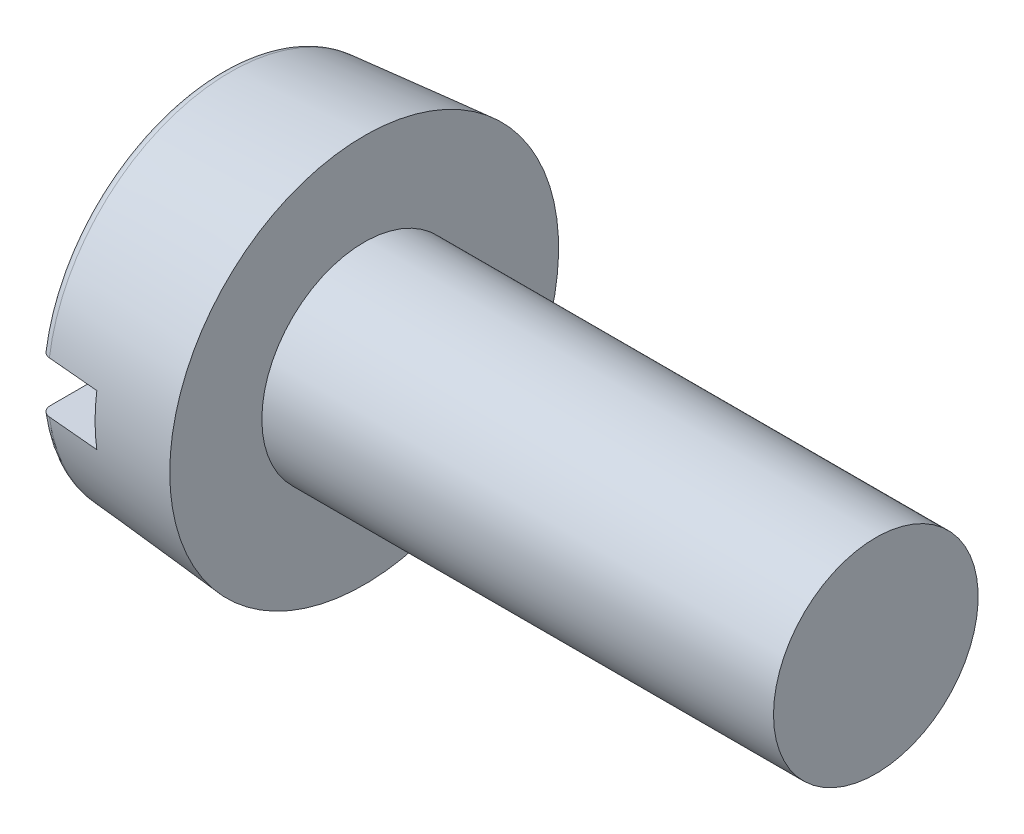
ISO-10303-21;
HEADER;
FILE_DESCRIPTION(('STEP AP214'),'2;1');
FILE_NAME('part.step','',(''),(''),'','','');
FILE_SCHEMA(('AUTOMOTIVE_DESIGN { 1 0 10303 214 1 1 1 1 }'));
ENDSEC;
DATA;
#1=APPLICATION_CONTEXT('core data for automotive mechanical design processes');
#2=APPLICATION_PROTOCOL_DEFINITION('international standard','automotive_design',2000,#1);
#3=PRODUCT_CONTEXT('',#1,'mechanical');
#4=PRODUCT('Part','Part','',(#3));
#5=PRODUCT_RELATED_PRODUCT_CATEGORY('part','',(#4));
#6=PRODUCT_DEFINITION_FORMATION('','',#4);
#7=PRODUCT_DEFINITION_CONTEXT('part definition',#1,'design');
#8=PRODUCT_DEFINITION('design','',#6,#7);
#9=PRODUCT_DEFINITION_SHAPE('','',#8);
#10=(LENGTH_UNIT() NAMED_UNIT(*) SI_UNIT(.MILLI.,.METRE.));
#11=(NAMED_UNIT(*) PLANE_ANGLE_UNIT() SI_UNIT($,.RADIAN.));
#12=(NAMED_UNIT(*) SI_UNIT($,.STERADIAN.) SOLID_ANGLE_UNIT());
#13=UNCERTAINTY_MEASURE_WITH_UNIT(LENGTH_MEASURE(1.E-05),#10,'distance_accuracy_value','');
#14=(GEOMETRIC_REPRESENTATION_CONTEXT(3) GLOBAL_UNCERTAINTY_ASSIGNED_CONTEXT((#13)) GLOBAL_UNIT_ASSIGNED_CONTEXT((#10,
#11,#12)) REPRESENTATION_CONTEXT('',''));
#15=CARTESIAN_POINT('',(0.,0.,0.));
#16=DIRECTION('',(0.,0.,1.));
#17=DIRECTION('',(1.,0.,0.));
#18=AXIS2_PLACEMENT_3D('',#15,#16,#17);
#19=CARTESIAN_POINT('',(0.,0.,0.));
#20=DIRECTION('',(-1.,0.,0.));
#21=DIRECTION('',(0.,0.,1.));
#22=AXIS2_PLACEMENT_3D('',#19,#20,#21);
#23=PLANE('',#22);
#24=DIRECTION('',(0.,0.,-1.));
#25=VECTOR('',#24,1.);
#26=CARTESIAN_POINT('',(0.,0.25,1.9));
#27=LINE('',#26,#25);
#28=CARTESIAN_POINT('',(0.,0.25,1.66724343126456));
#29=VERTEX_POINT('',#28);
#30=CARTESIAN_POINT('',(0.,0.25,-1.66724343126456));
#31=VERTEX_POINT('',#30);
#32=EDGE_CURVE('E84',#29,#31,#27,.T.);
#33=ORIENTED_EDGE('',*,*,#32,.F.);
#34=CARTESIAN_POINT('',(0.,0.,0.));
#35=DIRECTION('',(-1.,0.,0.));
#36=DIRECTION('',(0.,0.,1.));
#37=AXIS2_PLACEMENT_3D('',#34,#35,#36);
#38=CIRCLE('',#37,1.68588275366196);
#39=EDGE_CURVE('E86',#29,#31,#38,.T.);
#40=ORIENTED_EDGE('',*,*,#39,.T.);
#41=EDGE_LOOP('',(#33,#40));
#42=FACE_BOUND('',#41,.T.);
#43=ADVANCED_FACE('F16',(#42),#23,.T.);
#44=CARTESIAN_POINT('',(0.1,0.,0.));
#45=DIRECTION('',(-1.,0.,0.));
#46=DIRECTION('',(0.,0.,1.));
#47=AXIS2_PLACEMENT_3D('',#44,#45,#46);
#48=TOROIDAL_SURFACE('',#47,1.68588275366196,0.1);
#49=CARTESIAN_POINT('',(0.0301239837184526,0.25,-1.73954570987134));
#50=CARTESIAN_POINT('',(0.0341122540256549,0.25,-1.74348114703535));
#51=CARTESIAN_POINT('',(0.0384332916495908,0.25,-1.74708479745269));
#52=CARTESIAN_POINT('',(0.047621596888568,0.25,-1.75351988324919));
#53=CARTESIAN_POINT('',(0.0524894518418905,0.25,-1.75635047687334));
#54=CARTESIAN_POINT('',(0.0626321269057779,0.25,-1.7611518726827));
#55=CARTESIAN_POINT('',(0.0679068945512783,0.25,-1.76312278549306));
#56=CARTESIAN_POINT('',(0.07871224547132,0.25,-1.76614517825523));
#57=CARTESIAN_POINT('',(0.0842427666888276,0.25,-1.76719688002821));
#58=CARTESIAN_POINT('',(0.0953733944439471,0.25,-1.76834695503076));
#59=CARTESIAN_POINT('',(0.100972999637236,0.25,-1.76845018239128));
#60=CARTESIAN_POINT('',(0.112109811915657,0.25,-1.76771285537891));
#61=CARTESIAN_POINT('',(0.117647018058241,0.25,-1.76687228676909));
#62=CARTESIAN_POINT('',(0.128489803717952,0.25,-1.76427538353904));
#63=CARTESIAN_POINT('',(0.133795848010853,0.25,-1.76252098799906));
#64=CARTESIAN_POINT('',(0.14403973031954,0.25,-1.75814968615088));
#65=CARTESIAN_POINT('',(0.148977564711526,0.25,-1.75553277135542));
#66=CARTESIAN_POINT('',(0.15836674169469,0.25,-1.74950124280131));
#67=CARTESIAN_POINT('',(0.162816088565465,0.25,-1.74608352334629));
#68=CARTESIAN_POINT('',(0.171083921068068,0.25,-1.73855542384798));
#69=CARTESIAN_POINT('',(0.174902382724926,0.25,-1.73444501749311));
#70=CARTESIAN_POINT('',(0.181835504151915,0.25,-1.72561114445745));
#71=CARTESIAN_POINT('',(0.184943867145123,0.25,-1.72088273649891));
#72=CARTESIAN_POINT('',(0.190331805109599,0.25,-1.71097526726483));
#73=CARTESIAN_POINT('',(0.19261133485436,0.25,-1.7057961814165));
#74=CARTESIAN_POINT('',(0.19630050346213,0.25,-1.69507883946751));
#75=CARTESIAN_POINT('',(0.197701208750648,0.25,-1.68953750769915));
#76=CARTESIAN_POINT('',(0.199560107931746,0.25,-1.67829891478366));
#77=CARTESIAN_POINT('',(0.200018256978501,0.25,-1.67260164623029));
#78=CARTESIAN_POINT('',(0.199980488082452,0.25,-1.66116755240173));
#79=CARTESIAN_POINT('',(0.199477416691625,0.25,-1.65543074959807));
#80=CARTESIAN_POINT('',(0.197516883099685,0.25,-1.64412247089109));
#81=CARTESIAN_POINT('',(0.19605940106392,0.25,-1.6385509984262));
#82=CARTESIAN_POINT('',(0.192226434881595,0.25,-1.62772407078967));
#83=CARTESIAN_POINT('',(0.189849634285873,0.25,-1.62246908134511));
#84=CARTESIAN_POINT('',(0.184242507962168,0.25,-1.61243590232117));
#85=CARTESIAN_POINT('',(0.181012200803495,0.25,-1.60765770237164));
#86=CARTESIAN_POINT('',(0.173808398364609,0.25,-1.59874552852762));
#87=CARTESIAN_POINT('',(0.169839413654341,0.25,-1.59460791001411));
#88=CARTESIAN_POINT('',(0.161256212040593,0.25,-1.58706689346002));
#89=CARTESIAN_POINT('',(0.156642033668647,0.25,-1.58366345160462));
#90=CARTESIAN_POINT('',(0.146954193747203,0.25,-1.57772830420901));
#91=CARTESIAN_POINT('',(0.141886222152689,0.25,-1.57518731173971));
#92=CARTESIAN_POINT('',(0.131392256265676,0.25,-1.57100326499133));
#93=CARTESIAN_POINT('',(0.125966286684049,0.25,-1.5693601488087));
#94=CARTESIAN_POINT('',(0.114975418023079,0.25,-1.56703614777695));
#95=CARTESIAN_POINT('',(0.109412743361664,0.25,-1.56634473553344));
#96=CARTESIAN_POINT('',(0.0982506296477884,0.25,-1.56591134324024));
#97=CARTESIAN_POINT('',(0.0926511921124149,0.25,-1.56616932425487));
#98=CARTESIAN_POINT('',(0.0816068018037832,0.25,-1.56762261837648));
#99=CARTESIAN_POINT('',(0.0761611699810638,0.25,-1.56881278083002));
#100=CARTESIAN_POINT('',(0.0655461187744446,0.25,-1.57208782392461));
#101=CARTESIAN_POINT('',(0.0603767005480555,0.25,-1.5741727083148));
#102=CARTESIAN_POINT('',(0.0504429211594085,0.25,-1.57918218125947));
#103=CARTESIAN_POINT('',(0.045679818847785,0.25,-1.58210926476463));
#104=CARTESIAN_POINT('',(0.0367063855830669,0.25,-1.58871421123321));
#105=CARTESIAN_POINT('',(0.0324960808997952,0.25,-1.59239210985535));
#106=CARTESIAN_POINT('',(0.0247028499071558,0.25,-1.60043217731811));
#107=CARTESIAN_POINT('',(0.0211264966781289,0.25,-1.60480071638002));
#108=CARTESIAN_POINT('',(0.0147478039662313,0.25,-1.61407035663433));
#109=CARTESIAN_POINT('',(0.0119455146325413,0.25,-1.61897149230335));
#110=CARTESIAN_POINT('',(0.00716047536747469,0.25,-1.62922901712882));
#111=CARTESIAN_POINT('',(0.0051877301006121,0.25,-1.6345900743117));
#112=CARTESIAN_POINT('',(0.00216211004761551,0.25,-1.64556559292559));
#113=CARTESIAN_POINT('',(0.00110924708522813,0.25,-1.6511800576128));
#114=CARTESIAN_POINT('',(-5.33425649796273E-05,0.25,-1.66255157007252));
#115=CARTESIAN_POINT('',(-0.000155417619311508,0.25,-1.6683094013264));
#116=CARTESIAN_POINT('',(0.000607195995681125,0.25,-1.67976235656453));
#117=CARTESIAN_POINT('',(0.00147213868127254,0.25,-1.68545746367547));
#118=CARTESIAN_POINT('',(0.0041486989547703,0.25,-1.69663068032758));
#119=CARTESIAN_POINT('',(0.00596193608673292,0.25,-1.70210840133309));
#120=CARTESIAN_POINT('',(0.0104866705202575,0.25,-1.71267417663621));
#121=CARTESIAN_POINT('',(0.0131970742616456,0.25,-1.71776269608293));
#122=CARTESIAN_POINT('',(0.0183021368753954,0.25,-1.72564874312836));
#123=CARTESIAN_POINT('',(0.020453426675583,0.25,-1.72860667972899));
#124=CARTESIAN_POINT('',(0.0250639712199919,0.25,-1.73427200964239));
#125=CARTESIAN_POINT('',(0.0275232249959102,0.25,-1.73697940374288));
#126=CARTESIAN_POINT('',(0.0301239837184526,0.25,-1.73954570987134));
#127=B_SPLINE_CURVE_WITH_KNOTS('',3,(#49,#50,#51,#52,#53,#54,#55,#56,#57,#58,#59,#60,#61,#62,
#63,#64,#65,#66,#67,#68,#69,#70,#71,#72,#73,#74,#75,#76,#77,#78,#79,#80,#81,#82,#83,#84,#85,#86,
#87,#88,#89,#90,#91,#92,#93,#94,#95,#96,#97,#98,#99,#100,#101,#102,#103,#104,#105,#106,#107,
#108,#109,#110,#111,#112,#113,#114,#115,#116,#117,#118,#119,#120,#121,#122,#123,#124,#125,#126),
.UNSPECIFIED.,.T.,.F.,(4,2,2,2,2,2,2,2,2,2,2,2,2,2,2,2,2,2,2,2,2,2,2,2,2,2,2,2,2,2,2,2,2,2,2,2,
2,2,4),(0.,0.0167959110445539,0.0336100383184074,0.0504220012837815,0.0672299061172478,
0.0839517427346652,0.100673831600296,0.117360580985523,0.134047494574589,0.150800227323111,
0.167553596564519,0.184450209981752,0.201347745249248,0.21841437976708,0.235481826278522,
0.252676784421207,0.269872099922448,0.28709213054496,0.304311786550837,0.321429553193154,
0.338546297983665,0.355472401973106,0.372397338855155,0.389133511649819,0.405868998082987,
0.422512661437949,0.439156394534983,0.455849950224764,0.472544298931967,0.489402732254279,
0.506262257525771,0.523319657239101,0.540377276197225,0.557572051898687,0.574771345386102,
0.592000109063807,0.609207949388036,0.620160629655459,0.631113275486231),.UNSPECIFIED.);
#128=CARTESIAN_POINT('',(0.0912844257252333,0.25,-1.76791351316188));
#129=VERTEX_POINT('',#128);
#130=EDGE_CURVE('E40',#31,#129,#127,.T.);
#131=ORIENTED_EDGE('',*,*,#130,.F.);
#132=ORIENTED_EDGE('',*,*,#39,.F.);
#133=CARTESIAN_POINT('',(0.038410820052543,0.25,1.58753563015566));
#134=CARTESIAN_POINT('',(0.0427902939890945,0.25,1.58407005650774));
#135=CARTESIAN_POINT('',(0.0474630469549891,0.25,1.58096901798646));
#136=CARTESIAN_POINT('',(0.0572657439915531,0.25,1.57559125576911));
#137=CARTESIAN_POINT('',(0.0623961680717354,0.25,1.57331541051488));
#138=CARTESIAN_POINT('',(0.0729671844638347,0.25,1.56966008382672));
#139=CARTESIAN_POINT('',(0.0784077499033303,0.25,1.56828052486143));
#140=CARTESIAN_POINT('',(0.0894424523036429,0.25,1.56646066317196));
#141=CARTESIAN_POINT('',(0.0950365520436793,0.25,1.56602013480384));
#142=CARTESIAN_POINT('',(0.106187916851424,0.25,1.56609100566934));
#143=CARTESIAN_POINT('',(0.111745215600338,0.25,1.56659719462549));
#144=CARTESIAN_POINT('',(0.122695887603688,0.25,1.56853573821628));
#145=CARTESIAN_POINT('',(0.128089257112214,0.25,1.56996811399837));
#146=CARTESIAN_POINT('',(0.138558934280523,0.25,1.57371510963342));
#147=CARTESIAN_POINT('',(0.143635299693182,0.25,1.57602956823661));
#148=CARTESIAN_POINT('',(0.153331512379457,0.25,1.58147155156435));
#149=CARTESIAN_POINT('',(0.15795134553212,0.25,1.58459910142768));
#150=CARTESIAN_POINT('',(0.166642844689646,0.25,1.59160307133552));
#151=CARTESIAN_POINT('',(0.170709973240089,0.25,1.59548512047214));
#152=CARTESIAN_POINT('',(0.17814400538551,0.25,1.60386991016736));
#153=CARTESIAN_POINT('',(0.181510868111661,0.25,1.6083726869273));
#154=CARTESIAN_POINT('',(0.18749050008726,0.25,1.61792751523024));
#155=CARTESIAN_POINT('',(0.190093987175764,0.25,1.62298537603827));
#156=CARTESIAN_POINT('',(0.194424575068899,0.25,1.63346332336008));
#157=CARTESIAN_POINT('',(0.196151623655145,0.25,1.63888343143487));
#158=CARTESIAN_POINT('',(0.19869656706418,0.25,1.64999030292114));
#159=CARTESIAN_POINT('',(0.19950519348372,0.25,1.65567919157282));
#160=CARTESIAN_POINT('',(0.200160111365204,0.25,1.66711218979157));
#161=CARTESIAN_POINT('',(0.200006372625092,0.25,1.67285630108605));
#162=CARTESIAN_POINT('',(0.198737358913371,0.25,1.68426056047317));
#163=CARTESIAN_POINT('',(0.197618277112315,0.25,1.68992028578478));
#164=CARTESIAN_POINT('',(0.194442698747917,0.25,1.70097049473464));
#165=CARTESIAN_POINT('',(0.192386209487117,0.25,1.70636098046993));
#166=CARTESIAN_POINT('',(0.187399427297265,0.25,1.7166994325418));
#167=CARTESIAN_POINT('',(0.18447206309478,0.25,1.72164881093218));
#168=CARTESIAN_POINT('',(0.177821112560516,0.25,1.73098021623841));
#169=CARTESIAN_POINT('',(0.174097559800524,0.25,1.73536226706347));
#170=CARTESIAN_POINT('',(0.165993769608675,0.25,1.74339353418512));
#171=CARTESIAN_POINT('',(0.161619482864613,0.25,1.74704875411543));
#172=CARTESIAN_POINT('',(0.152314080979336,0.25,1.75356401214195));
#173=CARTESIAN_POINT('',(0.147382997277304,0.25,1.75642409510351));
#174=CARTESIAN_POINT('',(0.137157313470634,0.25,1.76123793804064));
#175=CARTESIAN_POINT('',(0.131866864335231,0.25,1.76320051691167));
#176=CARTESIAN_POINT('',(0.121030177928266,0.25,1.7662021188539));
#177=CARTESIAN_POINT('',(0.115483952770112,0.25,1.76724118561497));
#178=CARTESIAN_POINT('',(0.10433726421861,0.25,1.76836005573213));
#179=CARTESIAN_POINT('',(0.0987375081693256,0.25,1.76844691644335));
#180=CARTESIAN_POINT('',(0.0876033192585389,0.25,1.76767711814466));
#181=CARTESIAN_POINT('',(0.0820688850795546,0.25,1.76682047819726));
#182=CARTESIAN_POINT('',(0.0712339359121825,0.25,1.76419215705386));
#183=CARTESIAN_POINT('',(0.065932964474412,0.25,1.76242235604695));
#184=CARTESIAN_POINT('',(0.055701702864444,0.25,1.75802135089928));
#185=CARTESIAN_POINT('',(0.0507714167878425,0.25,1.75539013724273));
#186=CARTESIAN_POINT('',(0.0413993898846341,0.25,1.74933132383135));
#187=CARTESIAN_POINT('',(0.0369596773547095,0.25,1.74590058763537));
#188=CARTESIAN_POINT('',(0.0287131089970529,0.25,1.73834824703872));
#189=CARTESIAN_POINT('',(0.024906279451321,0.25,1.73422661396116));
#190=CARTESIAN_POINT('',(0.0179981143560022,0.25,1.72537218244404));
#191=CARTESIAN_POINT('',(0.0149031090922599,0.25,1.72063444579746));
#192=CARTESIAN_POINT('',(0.00954325096840195,0.25,1.71071066098417));
#193=CARTESIAN_POINT('',(0.00727844426054889,0.25,1.70552458791341));
#194=CARTESIAN_POINT('',(0.00361981721141334,0.25,1.69479566620519));
#195=CARTESIAN_POINT('',(0.00223495300327865,0.25,1.68924976295691));
#196=CARTESIAN_POINT('',(0.000408375366709955,0.25,1.67800493025775));
#197=CARTESIAN_POINT('',(-3.3329131902211E-05,0.25,1.67230599935852));
#198=CARTESIAN_POINT('',(3.75123327413306E-05,0.25,1.66087218591111));
#199=CARTESIAN_POINT('',(0.000557074784948396,0.25,1.65513734594056));
#200=CARTESIAN_POINT('',(0.00255033342308906,0.25,1.64383422369473));
#201=CARTESIAN_POINT('',(0.00402428246581615,0.25,1.63826598596849));
#202=CARTESIAN_POINT('',(0.00788999970877085,0.25,1.62744650084935));
#203=CARTESIAN_POINT('',(0.0102834602468341,0.25,1.62219585873013));
#204=CARTESIAN_POINT('',(0.015921704624391,0.25,1.61217899485774));
#205=CARTESIAN_POINT('',(0.019165452268332,0.25,1.607412193218));
#206=CARTESIAN_POINT('',(0.0251008031700795,0.25,1.60011257766084));
#207=CARTESIAN_POINT('',(0.0275686339076156,0.25,1.59739475707804));
#208=CARTESIAN_POINT('',(0.032785764913995,0.25,1.59224410808593));
#209=CARTESIAN_POINT('',(0.0355350642370452,0.25,1.58981127871903));
#210=CARTESIAN_POINT('',(0.038410820052543,0.25,1.58753563015566));
#211=B_SPLINE_CURVE_WITH_KNOTS('',3,(#133,#134,#135,#136,#137,#138,#139,#140,#141,#142,#143,
#144,#145,#146,#147,#148,#149,#150,#151,#152,#153,#154,#155,#156,#157,#158,#159,#160,#161,#162,
#163,#164,#165,#166,#167,#168,#169,#170,#171,#172,#173,#174,#175,#176,#177,#178,#179,#180,#181,
#182,#183,#184,#185,#186,#187,#188,#189,#190,#191,#192,#193,#194,#195,#196,#197,#198,#199,#200,
#201,#202,#203,#204,#205,#206,#207,#208,#209,#210),.UNSPECIFIED.,.T.,.F.,(4,2,2,2,2,2,2,2,2,2,2,
2,2,2,2,2,2,2,2,2,2,2,2,2,2,2,2,2,2,2,2,2,2,2,2,2,2,2,4),(0.,0.0167411910060388,
0.0335001515260854,0.0502576621545573,0.0670111455902049,0.0836726971117868,0.100334629076978,
0.116993516605717,0.133652919247716,0.150441746179843,0.167231552664631,0.18421776717599,
0.201204993610686,0.218362167205904,0.235519879250061,0.252745563649484,0.269971113860592,
0.287139377595869,0.304306917563327,0.321326154497721,0.338344430931905,0.355191689226128,
0.37203815046139,0.388759667571552,0.405480846845857,0.422167733967673,0.438854805431025,
0.455608474446361,0.472362839024727,0.489260888718256,0.506159877662992,0.523228221442543,
0.540296726824198,0.557490310608038,0.574688451553918,0.591918398070691,0.609127444285945,
0.620120485883897,0.631113490544153),.UNSPECIFIED.);
#212=CARTESIAN_POINT('',(0.0912844257209469,0.25,1.76791351317857));
#213=VERTEX_POINT('',#212);
#214=EDGE_CURVE('E76',#213,#29,#211,.T.);
#215=ORIENTED_EDGE('',*,*,#214,.F.);
#216=CARTESIAN_POINT('',(0.0912844257252333,0.,0.));
#217=DIRECTION('',(-1.,0.,0.));
#218=DIRECTION('',(0.,0.,1.));
#219=AXIS2_PLACEMENT_3D('',#216,#217,#218);
#220=CIRCLE('',#219,1.78550222347114);
#221=EDGE_CURVE('E90',#129,#213,#220,.F.);
#222=ORIENTED_EDGE('',*,*,#221,.F.);
#223=EDGE_LOOP('',(#131,#132,#215,#222));
#224=FACE_BOUND('',#223,.T.);
#225=ADVANCED_FACE('F167',(#224),#48,.T.);
#226=CARTESIAN_POINT('',(-25.4,0.,0.));
#227=DIRECTION('',(-1.,0.,0.));
#228=DIRECTION('',(0.,0.,1.));
#229=AXIS2_PLACEMENT_3D('',#226,#227,#228);
#230=CYLINDRICAL_SURFACE('',#229,1.);
#231=CARTESIAN_POINT('',(6.4,0.,0.));
#232=DIRECTION('',(-1.,0.,0.));
#233=DIRECTION('',(0.,0.,1.));
#234=AXIS2_PLACEMENT_3D('',#231,#232,#233);
#235=CIRCLE('',#234,1.);
#236=CARTESIAN_POINT('',(6.4,0.,1.));
#237=VERTEX_POINT('',#236);
#238=EDGE_CURVE('E87',#237,#237,#235,.T.);
#239=ORIENTED_EDGE('',*,*,#238,.T.);
#240=EDGE_LOOP('',(#239));
#241=FACE_BOUND('',#240,.T.);
#242=CARTESIAN_POINT('',(1.4,0.,0.));
#243=DIRECTION('',(-1.,0.,0.));
#244=DIRECTION('',(0.,0.,1.));
#245=AXIS2_PLACEMENT_3D('',#242,#243,#244);
#246=CIRCLE('',#245,1.);
#247=CARTESIAN_POINT('',(1.4,0.,1.));
#248=VERTEX_POINT('',#247);
#249=EDGE_CURVE('E154',#248,#248,#246,.T.);
#250=ORIENTED_EDGE('',*,*,#249,.F.);
#251=EDGE_LOOP('',(#250));
#252=FACE_BOUND('',#251,.T.);
#253=ADVANCED_FACE('F164',(#241,#252),#230,.T.);
#254=CARTESIAN_POINT('',(6.4,1.,0.));
#255=DIRECTION('',(1.,0.,0.));
#256=DIRECTION('',(0.,0.,-1.));
#257=AXIS2_PLACEMENT_3D('',#254,#255,#256);
#258=PLANE('',#257);
#259=ORIENTED_EDGE('',*,*,#238,.F.);
#260=EDGE_LOOP('',(#259));
#261=FACE_BOUND('',#260,.T.);
#262=ADVANCED_FACE('F166',(#261),#258,.T.);
#263=DIRECTION('',(0.,0.,1.));
#264=VECTOR('',#263,1.);
#265=CARTESIAN_POINT('',(0.,-0.25,-1.9));
#266=LINE('',#265,#264);
#267=CARTESIAN_POINT('',(0.,-0.25,-1.66724343126456));
#268=VERTEX_POINT('',#267);
#269=CARTESIAN_POINT('',(0.,-0.25,1.66724343126456));
#270=VERTEX_POINT('',#269);
#271=EDGE_CURVE('E32',#268,#270,#266,.T.);
#272=ORIENTED_EDGE('',*,*,#271,.F.);
#273=EDGE_CURVE('E82',#268,#270,#38,.T.);
#274=ORIENTED_EDGE('',*,*,#273,.T.);
#275=EDGE_LOOP('',(#272,#274));
#276=FACE_BOUND('',#275,.T.);
#277=ADVANCED_FACE('F81',(#276),#23,.T.);
#278=CARTESIAN_POINT('',(0.,0.,0.));
#279=DIRECTION('',(1.,0.,0.));
#280=DIRECTION('',(0.,0.,-1.));
#281=AXIS2_PLACEMENT_3D('',#278,#279,#280);
#282=CONICAL_SURFACE('',#281,1.7775158710637,0.0872664625997165);
#283=CARTESIAN_POINT('',(3.6210781881066,0.25,2.07934430853245));
#284=CARTESIAN_POINT('',(3.06980125604964,0.25,2.03076587392467));
#285=CARTESIAN_POINT('',(2.51852633750628,0.25,1.98216457470873));
#286=CARTESIAN_POINT('',(1.41598182372261,0.25,1.88490176224617));
#287=CARTESIAN_POINT('',(0.86471222848219,0.25,1.83624024900076));
#288=CARTESIAN_POINT('',(-0.237820369493235,0.25,1.7388425212793));
#289=CARTESIAN_POINT('',(-0.789083372228187,0.25,1.69010630680258));
#290=CARTESIAN_POINT('',(-1.89160065704932,0.25,1.59253521876817));
#291=CARTESIAN_POINT('',(-2.44285493913533,0.25,1.54370034520849));
#292=CARTESIAN_POINT('',(-2.99410378813087,0.25,1.49480416395094));
#293=B_SPLINE_CURVE_WITH_KNOTS('',3,(#283,#284,#285,#286,#287,#288,#289,#290,#291,#292),
.UNSPECIFIED.,.F.,.F.,(4,2,2,2,4),(0.,1.66023946632278,3.32047889930815,4.98071834715392,
6.64095782861457),.UNSPECIFIED.);
#294=CARTESIAN_POINT('',(0.6,0.25,1.8128522259904));
#295=VERTEX_POINT('',#294);
#296=EDGE_CURVE('E143',#295,#213,#293,.T.);
#297=ORIENTED_EDGE('',*,*,#296,.F.);
#298=CARTESIAN_POINT('',(0.6,0.,0.));
#299=DIRECTION('',(1.,0.,0.));
#300=DIRECTION('',(0.,0.,-1.));
#301=AXIS2_PLACEMENT_3D('',#298,#299,#300);
#302=CIRCLE('',#301,1.83000906917926);
#303=CARTESIAN_POINT('',(0.6,-0.25,1.8128522259904));
#304=VERTEX_POINT('',#303);
#305=EDGE_CURVE('E11',#304,#295,#302,.F.);
#306=ORIENTED_EDGE('',*,*,#305,.F.);
#307=CARTESIAN_POINT('',(-2.99410378813087,-0.25,1.49480416395094));
#308=CARTESIAN_POINT('',(-2.06836137178344,-0.25,1.57691372931173));
#309=CARTESIAN_POINT('',(-1.14260434025588,-0.25,1.65885820727605));
#310=CARTESIAN_POINT('',(-0.0400762748424803,-0.25,1.75630736694366));
#311=CARTESIAN_POINT('',(0.136684651711361,-0.25,1.77192637736924));
#312=CARTESIAN_POINT('',(1.41597857948217,-0.25,1.88493859856276));
#313=CARTESIAN_POINT('',(2.51852498766332,-0.25,1.98218009580805));
#314=CARTESIAN_POINT('',(3.6210781881066,-0.25,2.07934430853245));
#315=B_SPLINE_CURVE_WITH_KNOTS('',3,(#307,#308,#309,#310,#311,#312,#313,#314),.UNSPECIFIED.,.F.,
.F.,(4,2,2,4),(0.,2.78812996950874,3.32047892237668,6.64095781673274),.UNSPECIFIED.);
#316=CARTESIAN_POINT('',(0.0912844257252334,-0.25,1.76791351316188));
#317=VERTEX_POINT('',#316);
#318=EDGE_CURVE('E119',#317,#304,#315,.T.);
#319=ORIENTED_EDGE('',*,*,#318,.F.);
#320=CARTESIAN_POINT('',(0.091284425720508,-0.25,-1.76791351318017));
#321=VERTEX_POINT('',#320);
#322=EDGE_CURVE('E96',#317,#321,#220,.F.);
#323=ORIENTED_EDGE('',*,*,#322,.T.);
#324=CARTESIAN_POINT('',(3.6210781881066,-0.25,-2.07934430853245));
#325=CARTESIAN_POINT('',(3.06980125604964,-0.25,-2.03076587392467));
#326=CARTESIAN_POINT('',(2.51852633750628,-0.25,-1.98216457470873));
#327=CARTESIAN_POINT('',(1.41598182372261,-0.25,-1.88490176224617));
#328=CARTESIAN_POINT('',(0.86471222848219,-0.25,-1.83624024900076));
#329=CARTESIAN_POINT('',(-0.237820369493235,-0.25,-1.7388425212793));
#330=CARTESIAN_POINT('',(-0.789083372228187,-0.25,-1.69010630680258));
#331=CARTESIAN_POINT('',(-1.89160065704932,-0.25,-1.59253521876817));
#332=CARTESIAN_POINT('',(-2.44285493913533,-0.25,-1.54370034520849));
#333=CARTESIAN_POINT('',(-2.99410378813087,-0.25,-1.49480416395094));
#334=B_SPLINE_CURVE_WITH_KNOTS('',3,(#324,#325,#326,#327,#328,#329,#330,#331,#332,#333),
.UNSPECIFIED.,.F.,.F.,(4,2,2,2,4),(0.,1.66023946632278,3.32047889930815,4.98071834715392,
6.64095782861457),.UNSPECIFIED.);
#335=CARTESIAN_POINT('',(0.6,-0.25,-1.8128522259904));
#336=VERTEX_POINT('',#335);
#337=EDGE_CURVE('E71',#336,#321,#334,.T.);
#338=ORIENTED_EDGE('',*,*,#337,.F.);
#339=CARTESIAN_POINT('',(0.6,0.25,-1.8128522259904));
#340=VERTEX_POINT('',#339);
#341=EDGE_CURVE('E21',#340,#336,#302,.F.);
#342=ORIENTED_EDGE('',*,*,#341,.F.);
#343=CARTESIAN_POINT('',(-2.99410378813087,0.25,-1.49480416395094));
#344=CARTESIAN_POINT('',(-2.06836137178344,0.25,-1.57691372931173));
#345=CARTESIAN_POINT('',(-1.14260434025588,0.25,-1.65885820727605));
#346=CARTESIAN_POINT('',(-0.0400762748424803,0.25,-1.75630736694366));
#347=CARTESIAN_POINT('',(0.136684651711361,0.25,-1.77192637736924));
#348=CARTESIAN_POINT('',(1.41597857948217,0.25,-1.88493859856276));
#349=CARTESIAN_POINT('',(2.51852498766332,0.25,-1.98218009580805));
#350=CARTESIAN_POINT('',(3.6210781881066,0.25,-2.07934430853245));
#351=B_SPLINE_CURVE_WITH_KNOTS('',3,(#343,#344,#345,#346,#347,#348,#349,#350),.UNSPECIFIED.,.F.,
.F.,(4,2,2,4),(0.,2.78812996950874,3.32047892237668,6.64095781673274),.UNSPECIFIED.);
#352=EDGE_CURVE('E148',#129,#340,#351,.T.);
#353=ORIENTED_EDGE('',*,*,#352,.F.);
#354=ORIENTED_EDGE('',*,*,#221,.T.);
#355=EDGE_LOOP('',(#297,#306,#319,#323,#338,#342,#353,#354));
#356=FACE_BOUND('',#355,.T.);
#357=CARTESIAN_POINT('',(1.4,0.,0.));
#358=DIRECTION('',(-1.,0.,0.));
#359=DIRECTION('',(0.,0.,1.));
#360=AXIS2_PLACEMENT_3D('',#357,#358,#359);
#361=CIRCLE('',#360,1.9);
#362=CARTESIAN_POINT('',(1.4,0.,1.9));
#363=VERTEX_POINT('',#362);
#364=EDGE_CURVE('E92',#363,#363,#361,.T.);
#365=ORIENTED_EDGE('',*,*,#364,.T.);
#366=EDGE_LOOP('',(#365));
#367=FACE_BOUND('',#366,.T.);
#368=ADVANCED_FACE('F132',(#356,#367),#282,.T.);
#369=CARTESIAN_POINT('',(1.4,1.,0.));
#370=DIRECTION('',(-1.,0.,0.));
#371=DIRECTION('',(0.,0.,1.));
#372=AXIS2_PLACEMENT_3D('',#369,#370,#371);
#373=PLANE('',#372);
#374=ORIENTED_EDGE('',*,*,#364,.F.);
#375=EDGE_LOOP('',(#374));
#376=FACE_BOUND('',#375,.T.);
#377=ORIENTED_EDGE('',*,*,#249,.T.);
#378=EDGE_LOOP('',(#377));
#379=FACE_BOUND('',#378,.T.);
#380=ADVANCED_FACE('F136',(#376,#379),#373,.F.);
#381=CARTESIAN_POINT('',(0.0301239837184526,-0.25,-1.73954570987134));
#382=CARTESIAN_POINT('',(0.0260780259282707,-0.25,-1.7355526396478));
#383=CARTESIAN_POINT('',(0.0223687128122033,-0.25,-1.73121218004399));
#384=CARTESIAN_POINT('',(0.0157302639131424,-0.25,-1.72196511132148));
#385=CARTESIAN_POINT('',(0.0128021718532189,-0.25,-1.71705775723464));
#386=CARTESIAN_POINT('',(0.0078115596339449,-0.25,-1.70682606234138));
#387=CARTESIAN_POINT('',(0.00574827888609249,-0.25,-1.70150209285375));
#388=CARTESIAN_POINT('',(0.0025389033246811,-0.25,-1.69058637396543));
#389=CARTESIAN_POINT('',(0.00139257748788429,-0.25,-1.68499469239027));
#390=CARTESIAN_POINT('',(4.10282908945428E-05,-0.25,-1.6736612271434));
#391=CARTESIAN_POINT('',(-0.000157937515953972,-0.25,-1.66791869666335));
#392=CARTESIAN_POINT('',(0.00040686833323957,-0.25,-1.65648081813977));
#393=CARTESIAN_POINT('',(0.00117071281055931,-0.25,-1.6507854736979));
#394=CARTESIAN_POINT('',(0.00364543682274085,-0.25,-1.63958072861034));
#395=CARTESIAN_POINT('',(0.00536002222944808,-0.25,-1.63407214566351));
#396=CARTESIAN_POINT('',(0.00969258991345518,-0.25,-1.62342232819609));
#397=CARTESIAN_POINT('',(0.0123105654239292,-0.25,-1.61828109092426));
#398=CARTESIAN_POINT('',(0.0183686871454059,-0.25,-1.60853152324288));
#399=CARTESIAN_POINT('',(0.0218060998642178,-0.25,-1.60392149509216));
#400=CARTESIAN_POINT('',(0.02941306181309,-0.25,-1.59535108561564));
#401=CARTESIAN_POINT('',(0.033582574319999,-0.25,-1.59139067172354));
#402=CARTESIAN_POINT('',(0.0424928099447958,-0.25,-1.58427405023075));
#403=CARTESIAN_POINT('',(0.047227590966096,-0.25,-1.58111040437777));
#404=CARTESIAN_POINT('',(0.0571661220583322,-0.25,-1.57563408783813));
#405=CARTESIAN_POINT('',(0.0623698398595656,-0.25,-1.57332135865154));
#406=CARTESIAN_POINT('',(0.0730321903589694,-0.25,-1.56964075335714));
#407=CARTESIAN_POINT('',(0.0784870693494756,-0.25,-1.5682620002125));
#408=CARTESIAN_POINT('',(0.0895514615468667,-0.25,-1.56644822093411));
#409=CARTESIAN_POINT('',(0.095160966176,-0.25,-1.56601314255693));
#410=CARTESIAN_POINT('',(0.106327002489757,-0.25,-1.56609980469677));
#411=CARTESIAN_POINT('',(0.111883595726444,-0.25,-1.56661383635248));
#412=CARTESIAN_POINT('',(0.122831388816505,-0.25,-1.56856777941325));
#413=CARTESIAN_POINT('',(0.128222590680129,-0.25,-1.57000767956016));
#414=CARTESIAN_POINT('',(0.138686958017419,-0.25,-1.57376928649222));
#415=CARTESIAN_POINT('',(0.143760167134577,-0.25,-1.57609087195876));
#416=CARTESIAN_POINT('',(0.153448951544548,-0.25,-1.58154646534634));
#417=CARTESIAN_POINT('',(0.158064511721778,-0.25,-1.58468050008924));
#418=CARTESIAN_POINT('',(0.166746542197498,-0.25,-1.59169675607619));
#419=CARTESIAN_POINT('',(0.170808452559137,-0.25,-1.59558461824979));
#420=CARTESIAN_POINT('',(0.178231167530173,-0.25,-1.60398009132926));
#421=CARTESIAN_POINT('',(0.181591930079706,-0.25,-1.60848773938745));
#422=CARTESIAN_POINT('',(0.187558577382552,-0.25,-1.61805131058344));
#423=CARTESIAN_POINT('',(0.190155167963793,-0.25,-1.62311303257518));
#424=CARTESIAN_POINT('',(0.194471398021903,-0.25,-1.63359750325318));
#425=CARTESIAN_POINT('',(0.196190986225804,-0.25,-1.63902027302674));
#426=CARTESIAN_POINT('',(0.198720541525037,-0.25,-1.6501311220685));
#427=CARTESIAN_POINT('',(0.199521253042963,-0.25,-1.65582131006132));
#428=CARTESIAN_POINT('',(0.200160205109374,-0.25,-1.66725556951255));
#429=CARTESIAN_POINT('',(0.199998414852101,-0.25,-1.67299964268973));
#430=CARTESIAN_POINT('',(0.198713360352001,-0.25,-1.68440229675822));
#431=CARTESIAN_POINT('',(0.197586318442358,-0.25,-1.6900604527342));
#432=CARTESIAN_POINT('',(0.194395171653612,-0.25,-1.70110618713494));
#433=CARTESIAN_POINT('',(0.192331075364088,-0.25,-1.70649376803945));
#434=CARTESIAN_POINT('',(0.187329743049282,-0.25,-1.71682501034087));
#435=CARTESIAN_POINT('',(0.184395458897692,-0.25,-1.7217701001031));
#436=CARTESIAN_POINT('',(0.177731477244739,-0.25,-1.73109181693493));
#437=CARTESIAN_POINT('',(0.174001811840985,-0.25,-1.73546846693245));
#438=CARTESIAN_POINT('',(0.16588691119851,-0.25,-1.74348794106844));
#439=CARTESIAN_POINT('',(0.161507629441039,-0.25,-1.74713678874591));
#440=CARTESIAN_POINT('',(0.152193383444686,-0.25,-1.75363855606621));
#441=CARTESIAN_POINT('',(0.147258449475751,-0.25,-1.75649151903658));
#442=CARTESIAN_POINT('',(0.137026259848381,-0.25,-1.76129070832175));
#443=CARTESIAN_POINT('',(0.131733133431451,-0.25,-1.76324573979348));
#444=CARTESIAN_POINT('',(0.120892616958677,-0.25,-1.76623183391573));
#445=CARTESIAN_POINT('',(0.11534524913605,-0.25,-1.76726297719812));
#446=CARTESIAN_POINT('',(0.104198164295004,-0.25,-1.76836600998606));
#447=CARTESIAN_POINT('',(0.0985991525060392,-0.25,-1.76844503986814));
#448=CARTESIAN_POINT('',(0.0874662076269174,-0.25,-1.76765975687259));
#449=CARTESIAN_POINT('',(0.0819322899786185,-0.25,-1.76679522454642));
#450=CARTESIAN_POINT('',(0.0710974014185305,-0.25,-1.76415096656148));
#451=CARTESIAN_POINT('',(0.0657960842145945,-0.25,-1.76237265523513));
#452=CARTESIAN_POINT('',(0.0555703957728269,-0.25,-1.75795545669432));
#453=CARTESIAN_POINT('',(0.0506455770568972,-0.25,-1.7553176113261));
#454=CARTESIAN_POINT('',(0.0431273776562807,-0.25,-1.75044285417604));
#455=CARTESIAN_POINT('',(0.0403727951884046,-0.25,-1.74844968976037));
#456=CARTESIAN_POINT('',(0.0350800601103,-0.25,-1.74419427547474));
#457=CARTESIAN_POINT('',(0.032541906754964,-0.25,-1.74193202653123));
#458=CARTESIAN_POINT('',(0.0301239837184526,-0.25,-1.73954570987134));
#459=B_SPLINE_CURVE_WITH_KNOTS('',3,(#381,#382,#383,#384,#385,#386,#387,#388,#389,#390,#391,
#392,#393,#394,#395,#396,#397,#398,#399,#400,#401,#402,#403,#404,#405,#406,#407,#408,#409,#410,
#411,#412,#413,#414,#415,#416,#417,#418,#419,#420,#421,#422,#423,#424,#425,#426,#427,#428,#429,
#430,#431,#432,#433,#434,#435,#436,#437,#438,#439,#440,#441,#442,#443,#444,#445,#446,#447,#448,
#449,#450,#451,#452,#453,#454,#455,#456,#457,#458),.UNSPECIFIED.,.T.,.F.,(4,2,2,2,2,2,2,2,2,2,2,
2,2,2,2,2,2,2,2,2,2,2,2,2,2,2,2,2,2,2,2,2,2,2,2,2,2,2,4),(0.,0.0170411722438949,
0.0341049990186816,0.0511537867645752,0.0681982777803335,0.0853551972527325,0.102513414450955,
0.119738987255991,0.136964431036013,0.154133198727654,0.171301105455751,0.188302245400993,
0.205302216311467,0.222100636581185,0.23889812683804,0.25555978426519,0.272221239097884,
0.288880402169165,0.305540115289018,0.322329672912015,0.339120237403428,0.356107292735507,
0.373095341083044,0.390253043299336,0.407411294666675,0.424637006068489,0.441862559572752,
0.459030335786743,0.476197419326212,0.493215918450515,0.510233490915957,0.527080425228573,
0.543925889090266,0.560644941023431,0.57736788221095,0.594065017517701,0.61074198894896,
0.620926075619137,0.631110127226808),.UNSPECIFIED.);
#460=EDGE_CURVE('E67',#321,#268,#459,.T.);
#461=ORIENTED_EDGE('',*,*,#460,.F.);
#462=ORIENTED_EDGE('',*,*,#322,.F.);
#463=CARTESIAN_POINT('',(0.0384108200525428,-0.25,1.58753563015566));
#464=CARTESIAN_POINT('',(0.0339573950704053,-0.25,1.5910603658954));
#465=CARTESIAN_POINT('',(0.0298007999429177,-0.25,1.59496730933873));
#466=CARTESIAN_POINT('',(0.0222010182064344,-0.25,1.60342863634491));
#467=CARTESIAN_POINT('',(0.0187588035663531,-0.25,1.60798388796708));
#468=CARTESIAN_POINT('',(0.0126884755380012,-0.25,1.61760223594505));
#469=CARTESIAN_POINT('',(0.0100595998475483,-0.25,1.62266485084517));
#470=CARTESIAN_POINT('',(0.0056827238826839,-0.25,1.63315559353335));
#471=CARTESIAN_POINT('',(0.00393449893167439,-0.25,1.63858362769256));
#472=CARTESIAN_POINT('',(0.00135420896618527,-0.25,1.6496959787203));
#473=CARTESIAN_POINT('',(0.000529062493142357,-0.25,1.65538190290297));
#474=CARTESIAN_POINT('',(-0.000159268616023074,-0.25,1.66681204026049));
#475=CARTESIAN_POINT('',(-2.23806129211017E-05,-0.25,1.67255625780414));
#476=CARTESIAN_POINT('',(0.00121306917338659,-0.25,1.68396387537009));
#477=CARTESIAN_POINT('',(0.00231549071302685,-0.25,1.68962685820058));
#478=CARTESIAN_POINT('',(0.00545847496257945,-0.25,1.70068635267493));
#479=CARTESIAN_POINT('',(0.00749902870568401,-0.25,1.70608286686519));
#480=CARTESIAN_POINT('',(0.0124553209196925,-0.25,1.71643631844882));
#481=CARTESIAN_POINT('',(0.0153681805259003,-0.25,1.72139463336573));
#482=CARTESIAN_POINT('',(0.0219918139097573,-0.25,1.73074625136145));
#483=CARTESIAN_POINT('',(0.0257025525730674,-0.25,1.73513957929153));
#484=CARTESIAN_POINT('',(0.0337830293566341,-0.25,1.7431954661646));
#485=CARTESIAN_POINT('',(0.0381468204499056,-0.25,1.74686398949027));
#486=CARTESIAN_POINT('',(0.0474336489372372,-0.25,1.7534074422751));
#487=CARTESIAN_POINT('',(0.0523566554179294,-0.25,1.75628241557152));
#488=CARTESIAN_POINT('',(0.0625688825799932,-0.25,1.76112700539213));
#489=CARTESIAN_POINT('',(0.0678539229214079,-0.25,1.76310543520284));
#490=CARTESIAN_POINT('',(0.0786825580230985,-0.25,1.76613938813517));
#491=CARTESIAN_POINT('',(0.0842261404099092,-0.25,1.76719495537608));
#492=CARTESIAN_POINT('',(0.0953701815790085,-0.25,1.76834682813952));
#493=CARTESIAN_POINT('',(0.100969908426045,-0.25,1.7684502251156));
#494=CARTESIAN_POINT('',(0.11210681306469,-0.25,1.76771321576233));
#495=CARTESIAN_POINT('',(0.117643992150452,-0.25,1.76687282899673));
#496=CARTESIAN_POINT('',(0.128486801349998,-0.25,1.76427628463559));
#497=CARTESIAN_POINT('',(0.133792894145408,-0.25,1.76252205760683));
#498=CARTESIAN_POINT('',(0.144036912707969,-0.25,1.75815107926835));
#499=CARTESIAN_POINT('',(0.148974834149096,-0.25,1.75553431782577));
#500=CARTESIAN_POINT('',(0.15836419767094,-0.25,1.74950308538222));
#501=CARTESIAN_POINT('',(0.162813645288572,-0.25,1.74608551042966));
#502=CARTESIAN_POINT('',(0.171081709116824,-0.25,1.73855767538295));
#503=CARTESIAN_POINT('',(0.174900300331172,-0.25,1.73444738785466));
#504=CARTESIAN_POINT('',(0.18183369697909,-0.25,1.72561373225442));
#505=CARTESIAN_POINT('',(0.184942206210862,-0.25,1.72088542303857));
#506=CARTESIAN_POINT('',(0.19033044770101,-0.25,1.7109781307854));
#507=CARTESIAN_POINT('',(0.192610135624698,-0.25,1.70579912365806));
#508=CARTESIAN_POINT('',(0.19629963411489,-0.25,1.69508191169097));
#509=CARTESIAN_POINT('',(0.197700511048479,-0.25,1.68954063085116));
#510=CARTESIAN_POINT('',(0.199559761114849,-0.25,1.67830210616433));
#511=CARTESIAN_POINT('',(0.200018088664459,-0.25,1.67260485478783));
#512=CARTESIAN_POINT('',(0.19998067881951,-0.25,1.66117076172758));
#513=CARTESIAN_POINT('',(0.199477787367227,-0.25,1.65543394229265));
#514=CARTESIAN_POINT('',(0.197517609613422,-0.25,1.64412560727952));
#515=CARTESIAN_POINT('',(0.19606030463383,-0.25,1.63855409493865));
#516=CARTESIAN_POINT('',(0.192227684515839,-0.25,1.62772705594972));
#517=CARTESIAN_POINT('',(0.189851052632653,-0.25,1.62247199508646));
#518=CARTESIAN_POINT('',(0.184244245083917,-0.25,1.6124386350999));
#519=CARTESIAN_POINT('',(0.181014086328863,-0.25,1.60766032653354));
#520=CARTESIAN_POINT('',(0.173810564074661,-0.25,1.59874791823183));
#521=CARTESIAN_POINT('',(0.169841712242574,-0.25,1.59461017322819));
#522=CARTESIAN_POINT('',(0.161258744744242,-0.25,1.58706887510163));
#523=CARTESIAN_POINT('',(0.156644666353808,-0.25,1.58366527959454));
#524=CARTESIAN_POINT('',(0.146956906135104,-0.25,1.57772975331653));
#525=CARTESIAN_POINT('',(0.141888904809586,-0.25,1.57518855169054));
#526=CARTESIAN_POINT('',(0.131395039843866,-0.25,1.57100420461337));
#527=CARTESIAN_POINT('',(0.125969215308606,-0.25,1.5693609612099));
#528=CARTESIAN_POINT('',(0.114979237434394,-0.25,1.56703676449653));
#529=CARTESIAN_POINT('',(0.109417329315998,-0.25,1.56634518516968));
#530=CARTESIAN_POINT('',(0.0982551532904771,-0.25,1.56591124754995));
#531=CARTESIAN_POINT('',(0.0926548774749353,-0.25,1.56616909121188));
#532=CARTESIAN_POINT('',(0.0816066443551731,-0.25,1.56762238853903));
#533=CARTESIAN_POINT('',(0.076158064937537,-0.25,1.5688131425548));
#534=CARTESIAN_POINT('',(0.0655421563582805,-0.25,1.57208964252859));
#535=CARTESIAN_POINT('',(0.0603744926639942,-0.25,1.57417429644248));
#536=CARTESIAN_POINT('',(0.0524104046253597,-0.25,1.57818971720466));
#537=CARTESIAN_POINT('',(0.0494794583378919,-0.25,1.57985966161507));
#538=CARTESIAN_POINT('',(0.0438011029424259,-0.25,1.583486746576));
#539=CARTESIAN_POINT('',(0.0410536927850416,-0.25,1.58544388548427));
#540=CARTESIAN_POINT('',(0.0384108200525428,-0.25,1.58753563015566));
#541=B_SPLINE_CURVE_WITH_KNOTS('',3,(#463,#464,#465,#466,#467,#468,#469,#470,#471,#472,#473,
#474,#475,#476,#477,#478,#479,#480,#481,#482,#483,#484,#485,#486,#487,#488,#489,#490,#491,#492,
#493,#494,#495,#496,#497,#498,#499,#500,#501,#502,#503,#504,#505,#506,#507,#508,#509,#510,#511,
#512,#513,#514,#515,#516,#517,#518,#519,#520,#521,#522,#523,#524,#525,#526,#527,#528,#529,#530,
#531,#532,#533,#534,#535,#536,#537,#538,#539,#540),.UNSPECIFIED.,.T.,.F.,(4,2,2,2,2,2,2,2,2,2,2,
2,2,2,2,2,2,2,2,2,2,2,2,2,2,2,2,2,2,2,2,2,2,2,2,2,2,2,4),(0.,0.017026032683684,
0.0340750808686458,0.051108101079096,0.0681367735254206,0.0852922394400308,0.10244900070648,
0.119674661423913,0.136900157499331,0.154069419429613,0.171237925902129,0.188258660059426,
0.2052784537698,0.2221271015527,0.238974943808383,0.255697206422082,0.272419122405356,
0.28910585430013,0.305792782233616,0.322545490967144,0.339298863330091,0.356195470160692,
0.373092980678955,0.390159593483888,0.407227031637653,0.424421992283971,0.441617289449299,
0.458837307047766,0.476056983500327,0.493174748345185,0.510291524676524,0.527217987985618,
0.544142604530749,0.560876668671793,0.577614292575123,0.594268136617214,0.610901692986446,
0.621005802745753,0.63110985472885),.UNSPECIFIED.);
#542=EDGE_CURVE('E77',#270,#317,#541,.T.);
#543=ORIENTED_EDGE('',*,*,#542,.F.);
#544=ORIENTED_EDGE('',*,*,#273,.F.);
#545=EDGE_LOOP('',(#461,#462,#543,#544));
#546=FACE_BOUND('',#545,.T.);
#547=ADVANCED_FACE('F18',(#546),#48,.T.);
#548=CARTESIAN_POINT('',(0.6,0.25,1.9));
#549=DIRECTION('',(0.,1.,0.));
#550=DIRECTION('',(0.,0.,1.));
#551=AXIS2_PLACEMENT_3D('',#548,#549,#550);
#552=PLANE('',#551);
#553=ORIENTED_EDGE('',*,*,#352,.T.);
#554=DIRECTION('',(0.,0.,-1.));
#555=VECTOR('',#554,1.);
#556=CARTESIAN_POINT('',(0.6,0.25,1.9));
#557=LINE('',#556,#555);
#558=EDGE_CURVE('E83',#295,#340,#557,.T.);
#559=ORIENTED_EDGE('',*,*,#558,.F.);
#560=ORIENTED_EDGE('',*,*,#296,.T.);
#561=ORIENTED_EDGE('',*,*,#214,.T.);
#562=ORIENTED_EDGE('',*,*,#32,.T.);
#563=ORIENTED_EDGE('',*,*,#130,.T.);
#564=EDGE_LOOP('',(#553,#559,#560,#561,#562,#563));
#565=FACE_BOUND('',#564,.T.);
#566=ADVANCED_FACE('F111',(#565),#552,.F.);
#567=CARTESIAN_POINT('',(0.6,-0.25,-1.9));
#568=DIRECTION('',(0.,-1.,0.));
#569=DIRECTION('',(0.,0.,-1.));
#570=AXIS2_PLACEMENT_3D('',#567,#568,#569);
#571=PLANE('',#570);
#572=ORIENTED_EDGE('',*,*,#337,.T.);
#573=ORIENTED_EDGE('',*,*,#460,.T.);
#574=ORIENTED_EDGE('',*,*,#271,.T.);
#575=ORIENTED_EDGE('',*,*,#542,.T.);
#576=ORIENTED_EDGE('',*,*,#318,.T.);
#577=DIRECTION('',(0.,0.,1.));
#578=VECTOR('',#577,1.);
#579=CARTESIAN_POINT('',(0.6,-0.25,-1.9));
#580=LINE('',#579,#578);
#581=EDGE_CURVE('E125',#336,#304,#580,.T.);
#582=ORIENTED_EDGE('',*,*,#581,.F.);
#583=EDGE_LOOP('',(#572,#573,#574,#575,#576,#582));
#584=FACE_BOUND('',#583,.T.);
#585=ADVANCED_FACE('F68',(#584),#571,.F.);
#586=CARTESIAN_POINT('',(0.6,-0.25,-1.9));
#587=DIRECTION('',(1.,0.,0.));
#588=DIRECTION('',(0.,0.,-1.));
#589=AXIS2_PLACEMENT_3D('',#586,#587,#588);
#590=PLANE('',#589);
#591=ORIENTED_EDGE('',*,*,#305,.T.);
#592=ORIENTED_EDGE('',*,*,#558,.T.);
#593=ORIENTED_EDGE('',*,*,#341,.T.);
#594=ORIENTED_EDGE('',*,*,#581,.T.);
#595=EDGE_LOOP('',(#591,#592,#593,#594));
#596=FACE_BOUND('',#595,.T.);
#597=ADVANCED_FACE('F110',(#596),#590,.F.);
#598=CLOSED_SHELL('',(#43,#225,#253,#262,#277,#368,#380,#547,#566,#585,#597));
#599=MANIFOLD_SOLID_BREP('B1',#598);
#600=ADVANCED_BREP_SHAPE_REPRESENTATION('',(#18,#599),#14);
#601=SHAPE_DEFINITION_REPRESENTATION(#9,#600);
ENDSEC;
END-ISO-10303-21;
